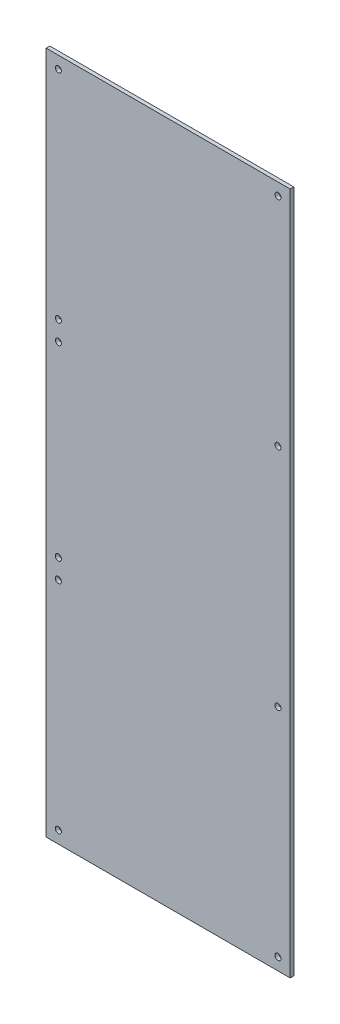
ISO-10303-21;
HEADER;
FILE_DESCRIPTION(('STEP AP214'),'2;1');
FILE_NAME('part.step','',(''),(''),'','','');
FILE_SCHEMA(('AUTOMOTIVE_DESIGN { 1 0 10303 214 1 1 1 1 }'));
ENDSEC;
DATA;
#1=APPLICATION_CONTEXT('core data for automotive mechanical design processes');
#2=APPLICATION_PROTOCOL_DEFINITION('international standard','automotive_design',2000,#1);
#3=PRODUCT_CONTEXT('',#1,'mechanical');
#4=PRODUCT('Part','Part','',(#3));
#5=PRODUCT_RELATED_PRODUCT_CATEGORY('part','',(#4));
#6=PRODUCT_DEFINITION_FORMATION('','',#4);
#7=PRODUCT_DEFINITION_CONTEXT('part definition',#1,'design');
#8=PRODUCT_DEFINITION('design','',#6,#7);
#9=PRODUCT_DEFINITION_SHAPE('','',#8);
#10=(LENGTH_UNIT() NAMED_UNIT(*) SI_UNIT(.MILLI.,.METRE.));
#11=(NAMED_UNIT(*) PLANE_ANGLE_UNIT() SI_UNIT($,.RADIAN.));
#12=(NAMED_UNIT(*) SI_UNIT($,.STERADIAN.) SOLID_ANGLE_UNIT());
#13=UNCERTAINTY_MEASURE_WITH_UNIT(LENGTH_MEASURE(1.E-05),#10,'distance_accuracy_value','');
#14=(GEOMETRIC_REPRESENTATION_CONTEXT(3) GLOBAL_UNCERTAINTY_ASSIGNED_CONTEXT((#13)) GLOBAL_UNIT_ASSIGNED_CONTEXT((#10,
#11,#12)) REPRESENTATION_CONTEXT('',''));
#15=CARTESIAN_POINT('',(0.,0.,0.));
#16=DIRECTION('',(0.,0.,1.));
#17=DIRECTION('',(1.,0.,0.));
#18=AXIS2_PLACEMENT_3D('',#15,#16,#17);
#19=CARTESIAN_POINT('',(-34.3589743589744,84.102564102564,3.));
#20=DIRECTION('',(1.,0.,0.));
#21=DIRECTION('',(0.,1.,0.));
#22=AXIS2_PLACEMENT_3D('',#19,#20,#21);
#23=PLANE('',#22);
#24=DIRECTION('',(0.,-1.,0.));
#25=VECTOR('',#24,1.);
#26=CARTESIAN_POINT('',(-34.3589743589744,84.102564102564,0.));
#27=LINE('',#26,#25);
#28=CARTESIAN_POINT('',(-34.3589743589744,84.102564102564,0.));
#29=VERTEX_POINT('',#28);
#30=CARTESIAN_POINT('',(-34.3589743589743,-475.897435897436,0.));
#31=VERTEX_POINT('',#30);
#32=EDGE_CURVE('E95',#29,#31,#27,.T.);
#33=ORIENTED_EDGE('',*,*,#32,.T.);
#34=DIRECTION('',(0.,0.,-1.));
#35=VECTOR('',#34,1.);
#36=CARTESIAN_POINT('',(-34.3589743589743,-475.897435897436,3.));
#37=LINE('',#36,#35);
#38=CARTESIAN_POINT('',(-34.3589743589743,-475.897435897436,3.));
#39=VERTEX_POINT('',#38);
#40=EDGE_CURVE('E11',#39,#31,#37,.T.);
#41=ORIENTED_EDGE('',*,*,#40,.F.);
#42=DIRECTION('',(0.,-1.,0.));
#43=VECTOR('',#42,1.);
#44=CARTESIAN_POINT('',(-34.3589743589744,84.102564102564,3.));
#45=LINE('',#44,#43);
#46=CARTESIAN_POINT('',(-34.3589743589744,84.102564102564,3.));
#47=VERTEX_POINT('',#46);
#48=EDGE_CURVE('E83',#47,#39,#45,.T.);
#49=ORIENTED_EDGE('',*,*,#48,.F.);
#50=DIRECTION('',(0.,0.,-1.));
#51=VECTOR('',#50,1.);
#52=CARTESIAN_POINT('',(-34.3589743589744,84.102564102564,3.));
#53=LINE('',#52,#51);
#54=EDGE_CURVE('E91',#47,#29,#53,.T.);
#55=ORIENTED_EDGE('',*,*,#54,.T.);
#56=EDGE_LOOP('',(#33,#41,#49,#55));
#57=FACE_BOUND('',#56,.T.);
#58=ADVANCED_FACE('F32',(#57),#23,.F.);
#59=CARTESIAN_POINT('',(-34.3589743589743,-475.897435897436,3.));
#60=DIRECTION('',(0.,1.,0.));
#61=DIRECTION('',(0.,0.,1.));
#62=AXIS2_PLACEMENT_3D('',#59,#60,#61);
#63=PLANE('',#62);
#64=DIRECTION('',(1.,0.,0.));
#65=VECTOR('',#64,1.);
#66=CARTESIAN_POINT('',(-34.3589743589743,-475.897435897436,0.));
#67=LINE('',#66,#65);
#68=CARTESIAN_POINT('',(165.641025641026,-475.897435897436,0.));
#69=VERTEX_POINT('',#68);
#70=EDGE_CURVE('E87',#31,#69,#67,.T.);
#71=ORIENTED_EDGE('',*,*,#70,.T.);
#72=DIRECTION('',(0.,0.,-1.));
#73=VECTOR('',#72,1.);
#74=CARTESIAN_POINT('',(165.641025641026,-475.897435897436,3.));
#75=LINE('',#74,#73);
#76=CARTESIAN_POINT('',(165.641025641026,-475.897435897436,3.));
#77=VERTEX_POINT('',#76);
#78=EDGE_CURVE('E40',#77,#69,#75,.T.);
#79=ORIENTED_EDGE('',*,*,#78,.F.);
#80=DIRECTION('',(1.,0.,0.));
#81=VECTOR('',#80,1.);
#82=CARTESIAN_POINT('',(-34.3589743589743,-475.897435897436,3.));
#83=LINE('',#82,#81);
#84=EDGE_CURVE('E78',#39,#77,#83,.T.);
#85=ORIENTED_EDGE('',*,*,#84,.F.);
#86=ORIENTED_EDGE('',*,*,#40,.T.);
#87=EDGE_LOOP('',(#71,#79,#85,#86));
#88=FACE_BOUND('',#87,.T.);
#89=ADVANCED_FACE('F86',(#88),#63,.F.);
#90=CARTESIAN_POINT('',(165.641025641026,84.102564102564,3.));
#91=DIRECTION('',(-1.,0.,0.));
#92=DIRECTION('',(0.,-1.,0.));
#93=AXIS2_PLACEMENT_3D('',#90,#91,#92);
#94=PLANE('',#93);
#95=DIRECTION('',(0.,1.,0.));
#96=VECTOR('',#95,1.);
#97=CARTESIAN_POINT('',(165.641025641026,84.102564102564,0.));
#98=LINE('',#97,#96);
#99=CARTESIAN_POINT('',(165.641025641026,84.102564102564,0.));
#100=VERTEX_POINT('',#99);
#101=EDGE_CURVE('E65',#69,#100,#98,.T.);
#102=ORIENTED_EDGE('',*,*,#101,.T.);
#103=DIRECTION('',(0.,0.,-1.));
#104=VECTOR('',#103,1.);
#105=CARTESIAN_POINT('',(165.641025641026,84.102564102564,3.));
#106=LINE('',#105,#104);
#107=CARTESIAN_POINT('',(165.641025641026,84.102564102564,3.));
#108=VERTEX_POINT('',#107);
#109=EDGE_CURVE('E88',#108,#100,#106,.T.);
#110=ORIENTED_EDGE('',*,*,#109,.F.);
#111=DIRECTION('',(0.,1.,0.));
#112=VECTOR('',#111,1.);
#113=CARTESIAN_POINT('',(165.641025641026,84.102564102564,3.));
#114=LINE('',#113,#112);
#115=EDGE_CURVE('E81',#77,#108,#114,.T.);
#116=ORIENTED_EDGE('',*,*,#115,.F.);
#117=ORIENTED_EDGE('',*,*,#78,.T.);
#118=EDGE_LOOP('',(#102,#110,#116,#117));
#119=FACE_BOUND('',#118,.T.);
#120=ADVANCED_FACE('F89',(#119),#94,.F.);
#121=CARTESIAN_POINT('',(-34.3589743589744,84.102564102564,3.));
#122=DIRECTION('',(0.,-1.,0.));
#123=DIRECTION('',(0.,0.,-1.));
#124=AXIS2_PLACEMENT_3D('',#121,#122,#123);
#125=PLANE('',#124);
#126=DIRECTION('',(-1.,0.,0.));
#127=VECTOR('',#126,1.);
#128=CARTESIAN_POINT('',(-34.3589743589744,84.102564102564,0.));
#129=LINE('',#128,#127);
#130=EDGE_CURVE('E71',#100,#29,#129,.T.);
#131=ORIENTED_EDGE('',*,*,#130,.T.);
#132=ORIENTED_EDGE('',*,*,#54,.F.);
#133=DIRECTION('',(-1.,0.,0.));
#134=VECTOR('',#133,1.);
#135=CARTESIAN_POINT('',(-34.3589743589744,84.102564102564,3.));
#136=LINE('',#135,#134);
#137=EDGE_CURVE('E48',#108,#47,#136,.T.);
#138=ORIENTED_EDGE('',*,*,#137,.F.);
#139=ORIENTED_EDGE('',*,*,#109,.T.);
#140=EDGE_LOOP('',(#131,#132,#138,#139));
#141=FACE_BOUND('',#140,.T.);
#142=ADVANCED_FACE('F103',(#141),#125,.F.);
#143=CARTESIAN_POINT('',(0.,0.,3.));
#144=DIRECTION('',(0.,0.,1.));
#145=DIRECTION('',(1.,0.,0.));
#146=AXIS2_PLACEMENT_3D('',#143,#144,#145);
#147=PLANE('',#146);
#148=CARTESIAN_POINT('',(155.641025641026,-288.397435897436,3.));
#149=DIRECTION('',(0.,0.,1.));
#150=DIRECTION('',(1.,0.,0.));
#151=AXIS2_PLACEMENT_3D('',#148,#149,#150);
#152=CIRCLE('',#151,2.5);
#153=CARTESIAN_POINT('',(158.141025641026,-288.397435897436,3.));
#154=VERTEX_POINT('',#153);
#155=EDGE_CURVE('E139',#154,#154,#152,.T.);
#156=ORIENTED_EDGE('',*,*,#155,.F.);
#157=EDGE_LOOP('',(#156));
#158=FACE_BOUND('',#157,.T.);
#159=CARTESIAN_POINT('',(-24.3589743589744,-119.397435897436,3.));
#160=DIRECTION('',(0.,0.,1.));
#161=DIRECTION('',(1.,0.,0.));
#162=AXIS2_PLACEMENT_3D('',#159,#160,#161);
#163=CIRCLE('',#162,2.5);
#164=CARTESIAN_POINT('',(-21.8589743589744,-119.397435897436,3.));
#165=VERTEX_POINT('',#164);
#166=EDGE_CURVE('E146',#165,#165,#163,.T.);
#167=ORIENTED_EDGE('',*,*,#166,.F.);
#168=EDGE_LOOP('',(#167));
#169=FACE_BOUND('',#168,.T.);
#170=CARTESIAN_POINT('',(155.641025641026,-103.397435897436,3.));
#171=DIRECTION('',(0.,0.,1.));
#172=DIRECTION('',(1.,0.,0.));
#173=AXIS2_PLACEMENT_3D('',#170,#171,#172);
#174=CIRCLE('',#173,2.5);
#175=CARTESIAN_POINT('',(158.141025641026,-103.397435897436,3.));
#176=VERTEX_POINT('',#175);
#177=EDGE_CURVE('E152',#176,#176,#174,.T.);
#178=ORIENTED_EDGE('',*,*,#177,.F.);
#179=EDGE_LOOP('',(#178));
#180=FACE_BOUND('',#179,.T.);
#181=CARTESIAN_POINT('',(-24.3589743589744,-103.397435897436,3.));
#182=DIRECTION('',(0.,0.,1.));
#183=DIRECTION('',(1.,0.,0.));
#184=AXIS2_PLACEMENT_3D('',#181,#182,#183);
#185=CIRCLE('',#184,2.5);
#186=CARTESIAN_POINT('',(-21.8589743589744,-103.397435897436,3.));
#187=VERTEX_POINT('',#186);
#188=EDGE_CURVE('E158',#187,#187,#185,.T.);
#189=ORIENTED_EDGE('',*,*,#188,.F.);
#190=EDGE_LOOP('',(#189));
#191=FACE_BOUND('',#190,.T.);
#192=CARTESIAN_POINT('',(155.641025641026,74.102564102564,3.));
#193=DIRECTION('',(0.,0.,1.));
#194=DIRECTION('',(1.,0.,0.));
#195=AXIS2_PLACEMENT_3D('',#192,#193,#194);
#196=CIRCLE('',#195,2.5);
#197=CARTESIAN_POINT('',(158.141025641026,74.102564102564,3.));
#198=VERTEX_POINT('',#197);
#199=EDGE_CURVE('E122',#198,#198,#196,.T.);
#200=ORIENTED_EDGE('',*,*,#199,.F.);
#201=EDGE_LOOP('',(#200));
#202=FACE_BOUND('',#201,.T.);
#203=CARTESIAN_POINT('',(-24.3589743589744,-465.897435897436,3.));
#204=DIRECTION('',(0.,0.,1.));
#205=DIRECTION('',(1.,0.,0.));
#206=AXIS2_PLACEMENT_3D('',#203,#204,#205);
#207=CIRCLE('',#206,2.5);
#208=CARTESIAN_POINT('',(-21.8589743589744,-465.897435897436,3.));
#209=VERTEX_POINT('',#208);
#210=EDGE_CURVE('E115',#209,#209,#207,.T.);
#211=ORIENTED_EDGE('',*,*,#210,.F.);
#212=EDGE_LOOP('',(#211));
#213=FACE_BOUND('',#212,.T.);
#214=CARTESIAN_POINT('',(155.641025641026,-465.897435897436,3.));
#215=DIRECTION('',(0.,0.,1.));
#216=DIRECTION('',(1.,0.,0.));
#217=AXIS2_PLACEMENT_3D('',#214,#215,#216);
#218=CIRCLE('',#217,2.5);
#219=CARTESIAN_POINT('',(158.141025641026,-465.897435897436,3.));
#220=VERTEX_POINT('',#219);
#221=EDGE_CURVE('E134',#220,#220,#218,.T.);
#222=ORIENTED_EDGE('',*,*,#221,.F.);
#223=EDGE_LOOP('',(#222));
#224=FACE_BOUND('',#223,.T.);
#225=CARTESIAN_POINT('',(-24.3589743589744,-288.397435897436,3.));
#226=DIRECTION('',(0.,0.,1.));
#227=DIRECTION('',(1.,0.,0.));
#228=AXIS2_PLACEMENT_3D('',#225,#226,#227);
#229=CIRCLE('',#228,2.5);
#230=CARTESIAN_POINT('',(-21.8589743589744,-288.397435897436,3.));
#231=VERTEX_POINT('',#230);
#232=EDGE_CURVE('E127',#231,#231,#229,.T.);
#233=ORIENTED_EDGE('',*,*,#232,.F.);
#234=EDGE_LOOP('',(#233));
#235=FACE_BOUND('',#234,.T.);
#236=CARTESIAN_POINT('',(-24.3589743589744,-272.397435897436,3.));
#237=DIRECTION('',(0.,0.,1.));
#238=DIRECTION('',(1.,0.,0.));
#239=AXIS2_PLACEMENT_3D('',#236,#237,#238);
#240=CIRCLE('',#239,2.5);
#241=CARTESIAN_POINT('',(-21.8589743589744,-272.397435897436,3.));
#242=VERTEX_POINT('',#241);
#243=EDGE_CURVE('E163',#242,#242,#240,.T.);
#244=ORIENTED_EDGE('',*,*,#243,.F.);
#245=EDGE_LOOP('',(#244));
#246=FACE_BOUND('',#245,.T.);
#247=CARTESIAN_POINT('',(-24.3589743589744,74.102564102564,3.));
#248=DIRECTION('',(0.,0.,1.));
#249=DIRECTION('',(1.,0.,0.));
#250=AXIS2_PLACEMENT_3D('',#247,#248,#249);
#251=CIRCLE('',#250,2.5);
#252=CARTESIAN_POINT('',(-21.8589743589744,74.102564102564,3.));
#253=VERTEX_POINT('',#252);
#254=EDGE_CURVE('E109',#253,#253,#251,.T.);
#255=ORIENTED_EDGE('',*,*,#254,.F.);
#256=EDGE_LOOP('',(#255));
#257=FACE_BOUND('',#256,.T.);
#258=ORIENTED_EDGE('',*,*,#48,.T.);
#259=ORIENTED_EDGE('',*,*,#84,.T.);
#260=ORIENTED_EDGE('',*,*,#115,.T.);
#261=ORIENTED_EDGE('',*,*,#137,.T.);
#262=EDGE_LOOP('',(#258,#259,#260,#261));
#263=FACE_BOUND('',#262,.T.);
#264=ADVANCED_FACE('F79',(#158,#169,#180,#191,#202,#213,#224,#235,#246,#257,#263),#147,.T.);
#265=CARTESIAN_POINT('',(0.,0.,0.));
#266=DIRECTION('',(0.,0.,1.));
#267=DIRECTION('',(1.,0.,0.));
#268=AXIS2_PLACEMENT_3D('',#265,#266,#267);
#269=PLANE('',#268);
#270=CARTESIAN_POINT('',(155.641025641026,-288.397435897436,0.));
#271=DIRECTION('',(0.,0.,1.));
#272=DIRECTION('',(1.,0.,0.));
#273=AXIS2_PLACEMENT_3D('',#270,#271,#272);
#274=CIRCLE('',#273,2.5);
#275=CARTESIAN_POINT('',(158.141025641026,-288.397435897436,0.));
#276=VERTEX_POINT('',#275);
#277=EDGE_CURVE('E142',#276,#276,#274,.T.);
#278=ORIENTED_EDGE('',*,*,#277,.T.);
#279=EDGE_LOOP('',(#278));
#280=FACE_BOUND('',#279,.T.);
#281=CARTESIAN_POINT('',(-24.3589743589744,-119.397435897436,0.));
#282=DIRECTION('',(0.,0.,1.));
#283=DIRECTION('',(1.,0.,0.));
#284=AXIS2_PLACEMENT_3D('',#281,#282,#283);
#285=CIRCLE('',#284,2.5);
#286=CARTESIAN_POINT('',(-21.8589743589744,-119.397435897436,0.));
#287=VERTEX_POINT('',#286);
#288=EDGE_CURVE('E149',#287,#287,#285,.T.);
#289=ORIENTED_EDGE('',*,*,#288,.T.);
#290=EDGE_LOOP('',(#289));
#291=FACE_BOUND('',#290,.T.);
#292=CARTESIAN_POINT('',(155.641025641026,-103.397435897436,0.));
#293=DIRECTION('',(0.,0.,1.));
#294=DIRECTION('',(1.,0.,0.));
#295=AXIS2_PLACEMENT_3D('',#292,#293,#294);
#296=CIRCLE('',#295,2.5);
#297=CARTESIAN_POINT('',(158.141025641026,-103.397435897436,0.));
#298=VERTEX_POINT('',#297);
#299=EDGE_CURVE('E155',#298,#298,#296,.T.);
#300=ORIENTED_EDGE('',*,*,#299,.T.);
#301=EDGE_LOOP('',(#300));
#302=FACE_BOUND('',#301,.T.);
#303=CARTESIAN_POINT('',(-24.3589743589744,-103.397435897436,0.));
#304=DIRECTION('',(0.,0.,1.));
#305=DIRECTION('',(1.,0.,0.));
#306=AXIS2_PLACEMENT_3D('',#303,#304,#305);
#307=CIRCLE('',#306,2.5);
#308=CARTESIAN_POINT('',(-21.8589743589744,-103.397435897436,0.));
#309=VERTEX_POINT('',#308);
#310=EDGE_CURVE('E131',#309,#309,#307,.T.);
#311=ORIENTED_EDGE('',*,*,#310,.T.);
#312=EDGE_LOOP('',(#311));
#313=FACE_BOUND('',#312,.T.);
#314=CARTESIAN_POINT('',(155.641025641026,74.102564102564,0.));
#315=DIRECTION('',(0.,0.,1.));
#316=DIRECTION('',(1.,0.,0.));
#317=AXIS2_PLACEMENT_3D('',#314,#315,#316);
#318=CIRCLE('',#317,2.5);
#319=CARTESIAN_POINT('',(158.141025641026,74.102564102564,0.));
#320=VERTEX_POINT('',#319);
#321=EDGE_CURVE('E112',#320,#320,#318,.T.);
#322=ORIENTED_EDGE('',*,*,#321,.T.);
#323=EDGE_LOOP('',(#322));
#324=FACE_BOUND('',#323,.T.);
#325=CARTESIAN_POINT('',(-24.3589743589744,-465.897435897436,0.));
#326=DIRECTION('',(0.,0.,1.));
#327=DIRECTION('',(1.,0.,0.));
#328=AXIS2_PLACEMENT_3D('',#325,#326,#327);
#329=CIRCLE('',#328,2.5);
#330=CARTESIAN_POINT('',(-21.8589743589744,-465.897435897436,0.));
#331=VERTEX_POINT('',#330);
#332=EDGE_CURVE('E118',#331,#331,#329,.T.);
#333=ORIENTED_EDGE('',*,*,#332,.T.);
#334=EDGE_LOOP('',(#333));
#335=FACE_BOUND('',#334,.T.);
#336=CARTESIAN_POINT('',(155.641025641026,-465.897435897436,0.));
#337=DIRECTION('',(0.,0.,1.));
#338=DIRECTION('',(1.,0.,0.));
#339=AXIS2_PLACEMENT_3D('',#336,#337,#338);
#340=CIRCLE('',#339,2.5);
#341=CARTESIAN_POINT('',(158.141025641026,-465.897435897436,0.));
#342=VERTEX_POINT('',#341);
#343=EDGE_CURVE('E119',#342,#342,#340,.T.);
#344=ORIENTED_EDGE('',*,*,#343,.T.);
#345=EDGE_LOOP('',(#344));
#346=FACE_BOUND('',#345,.T.);
#347=CARTESIAN_POINT('',(-24.3589743589744,-288.397435897436,0.));
#348=DIRECTION('',(0.,0.,1.));
#349=DIRECTION('',(1.,0.,0.));
#350=AXIS2_PLACEMENT_3D('',#347,#348,#349);
#351=CIRCLE('',#350,2.5);
#352=CARTESIAN_POINT('',(-21.8589743589744,-288.397435897436,0.));
#353=VERTEX_POINT('',#352);
#354=EDGE_CURVE('E130',#353,#353,#351,.T.);
#355=ORIENTED_EDGE('',*,*,#354,.T.);
#356=EDGE_LOOP('',(#355));
#357=FACE_BOUND('',#356,.T.);
#358=CARTESIAN_POINT('',(-24.3589743589744,-272.397435897436,0.));
#359=DIRECTION('',(0.,0.,1.));
#360=DIRECTION('',(1.,0.,0.));
#361=AXIS2_PLACEMENT_3D('',#358,#359,#360);
#362=CIRCLE('',#361,2.5);
#363=CARTESIAN_POINT('',(-21.8589743589744,-272.397435897436,0.));
#364=VERTEX_POINT('',#363);
#365=EDGE_CURVE('E143',#364,#364,#362,.T.);
#366=ORIENTED_EDGE('',*,*,#365,.T.);
#367=EDGE_LOOP('',(#366));
#368=FACE_BOUND('',#367,.T.);
#369=CARTESIAN_POINT('',(-24.3589743589744,74.102564102564,0.));
#370=DIRECTION('',(0.,0.,1.));
#371=DIRECTION('',(1.,0.,0.));
#372=AXIS2_PLACEMENT_3D('',#369,#370,#371);
#373=CIRCLE('',#372,2.5);
#374=CARTESIAN_POINT('',(-21.8589743589744,74.102564102564,0.));
#375=VERTEX_POINT('',#374);
#376=EDGE_CURVE('E98',#375,#375,#373,.T.);
#377=ORIENTED_EDGE('',*,*,#376,.T.);
#378=EDGE_LOOP('',(#377));
#379=FACE_BOUND('',#378,.T.);
#380=ORIENTED_EDGE('',*,*,#32,.F.);
#381=ORIENTED_EDGE('',*,*,#130,.F.);
#382=ORIENTED_EDGE('',*,*,#101,.F.);
#383=ORIENTED_EDGE('',*,*,#70,.F.);
#384=EDGE_LOOP('',(#380,#381,#382,#383));
#385=FACE_BOUND('',#384,.T.);
#386=ADVANCED_FACE('F106',(#280,#291,#302,#313,#324,#335,#346,#357,#368,#379,#385),#269,.F.);
#387=CARTESIAN_POINT('',(-24.3589743589744,74.102564102564,0.));
#388=DIRECTION('',(0.,0.,1.));
#389=DIRECTION('',(1.,0.,0.));
#390=AXIS2_PLACEMENT_3D('',#387,#388,#389);
#391=CYLINDRICAL_SURFACE('',#390,2.5);
#392=ORIENTED_EDGE('',*,*,#376,.F.);
#393=EDGE_LOOP('',(#392));
#394=FACE_BOUND('',#393,.T.);
#395=ORIENTED_EDGE('',*,*,#254,.T.);
#396=EDGE_LOOP('',(#395));
#397=FACE_BOUND('',#396,.T.);
#398=ADVANCED_FACE('F175',(#394,#397),#391,.F.);
#399=CARTESIAN_POINT('',(-24.3589743589744,-272.397435897436,0.));
#400=DIRECTION('',(0.,0.,1.));
#401=DIRECTION('',(1.,0.,0.));
#402=AXIS2_PLACEMENT_3D('',#399,#400,#401);
#403=CYLINDRICAL_SURFACE('',#402,2.5);
#404=ORIENTED_EDGE('',*,*,#365,.F.);
#405=EDGE_LOOP('',(#404));
#406=FACE_BOUND('',#405,.T.);
#407=ORIENTED_EDGE('',*,*,#243,.T.);
#408=EDGE_LOOP('',(#407));
#409=FACE_BOUND('',#408,.T.);
#410=ADVANCED_FACE('F171',(#406,#409),#403,.F.);
#411=CARTESIAN_POINT('',(-24.3589743589744,-288.397435897436,0.));
#412=DIRECTION('',(0.,0.,1.));
#413=DIRECTION('',(1.,0.,0.));
#414=AXIS2_PLACEMENT_3D('',#411,#412,#413);
#415=CYLINDRICAL_SURFACE('',#414,2.5);
#416=ORIENTED_EDGE('',*,*,#354,.F.);
#417=EDGE_LOOP('',(#416));
#418=FACE_BOUND('',#417,.T.);
#419=ORIENTED_EDGE('',*,*,#232,.T.);
#420=EDGE_LOOP('',(#419));
#421=FACE_BOUND('',#420,.T.);
#422=ADVANCED_FACE('F174',(#418,#421),#415,.F.);
#423=CARTESIAN_POINT('',(155.641025641026,-465.897435897436,0.));
#424=DIRECTION('',(0.,0.,1.));
#425=DIRECTION('',(1.,0.,0.));
#426=AXIS2_PLACEMENT_3D('',#423,#424,#425);
#427=CYLINDRICAL_SURFACE('',#426,2.5);
#428=ORIENTED_EDGE('',*,*,#343,.F.);
#429=EDGE_LOOP('',(#428));
#430=FACE_BOUND('',#429,.T.);
#431=ORIENTED_EDGE('',*,*,#221,.T.);
#432=EDGE_LOOP('',(#431));
#433=FACE_BOUND('',#432,.T.);
#434=ADVANCED_FACE('F238',(#430,#433),#427,.F.);
#435=CARTESIAN_POINT('',(-24.3589743589744,-465.897435897436,0.));
#436=DIRECTION('',(0.,0.,1.));
#437=DIRECTION('',(1.,0.,0.));
#438=AXIS2_PLACEMENT_3D('',#435,#436,#437);
#439=CYLINDRICAL_SURFACE('',#438,2.5);
#440=ORIENTED_EDGE('',*,*,#332,.F.);
#441=EDGE_LOOP('',(#440));
#442=FACE_BOUND('',#441,.T.);
#443=ORIENTED_EDGE('',*,*,#210,.T.);
#444=EDGE_LOOP('',(#443));
#445=FACE_BOUND('',#444,.T.);
#446=ADVANCED_FACE('F248',(#442,#445),#439,.F.);
#447=CARTESIAN_POINT('',(155.641025641026,74.102564102564,0.));
#448=DIRECTION('',(0.,0.,1.));
#449=DIRECTION('',(1.,0.,0.));
#450=AXIS2_PLACEMENT_3D('',#447,#448,#449);
#451=CYLINDRICAL_SURFACE('',#450,2.5);
#452=ORIENTED_EDGE('',*,*,#321,.F.);
#453=EDGE_LOOP('',(#452));
#454=FACE_BOUND('',#453,.T.);
#455=ORIENTED_EDGE('',*,*,#199,.T.);
#456=EDGE_LOOP('',(#455));
#457=FACE_BOUND('',#456,.T.);
#458=ADVANCED_FACE('F258',(#454,#457),#451,.F.);
#459=CARTESIAN_POINT('',(-24.3589743589744,-103.397435897436,0.));
#460=DIRECTION('',(0.,0.,1.));
#461=DIRECTION('',(1.,0.,0.));
#462=AXIS2_PLACEMENT_3D('',#459,#460,#461);
#463=CYLINDRICAL_SURFACE('',#462,2.5);
#464=ORIENTED_EDGE('',*,*,#310,.F.);
#465=EDGE_LOOP('',(#464));
#466=FACE_BOUND('',#465,.T.);
#467=ORIENTED_EDGE('',*,*,#188,.T.);
#468=EDGE_LOOP('',(#467));
#469=FACE_BOUND('',#468,.T.);
#470=ADVANCED_FACE('F267',(#466,#469),#463,.F.);
#471=CARTESIAN_POINT('',(155.641025641026,-103.397435897436,0.));
#472=DIRECTION('',(0.,0.,1.));
#473=DIRECTION('',(1.,0.,0.));
#474=AXIS2_PLACEMENT_3D('',#471,#472,#473);
#475=CYLINDRICAL_SURFACE('',#474,2.5);
#476=ORIENTED_EDGE('',*,*,#299,.F.);
#477=EDGE_LOOP('',(#476));
#478=FACE_BOUND('',#477,.T.);
#479=ORIENTED_EDGE('',*,*,#177,.T.);
#480=EDGE_LOOP('',(#479));
#481=FACE_BOUND('',#480,.T.);
#482=ADVANCED_FACE('F277',(#478,#481),#475,.F.);
#483=CARTESIAN_POINT('',(-24.3589743589744,-119.397435897436,0.));
#484=DIRECTION('',(0.,0.,1.));
#485=DIRECTION('',(1.,0.,0.));
#486=AXIS2_PLACEMENT_3D('',#483,#484,#485);
#487=CYLINDRICAL_SURFACE('',#486,2.5);
#488=ORIENTED_EDGE('',*,*,#288,.F.);
#489=EDGE_LOOP('',(#488));
#490=FACE_BOUND('',#489,.T.);
#491=ORIENTED_EDGE('',*,*,#166,.T.);
#492=EDGE_LOOP('',(#491));
#493=FACE_BOUND('',#492,.T.);
#494=ADVANCED_FACE('F287',(#490,#493),#487,.F.);
#495=CARTESIAN_POINT('',(155.641025641026,-288.397435897436,0.));
#496=DIRECTION('',(0.,0.,1.));
#497=DIRECTION('',(1.,0.,0.));
#498=AXIS2_PLACEMENT_3D('',#495,#496,#497);
#499=CYLINDRICAL_SURFACE('',#498,2.5);
#500=ORIENTED_EDGE('',*,*,#277,.F.);
#501=EDGE_LOOP('',(#500));
#502=FACE_BOUND('',#501,.T.);
#503=ORIENTED_EDGE('',*,*,#155,.T.);
#504=EDGE_LOOP('',(#503));
#505=FACE_BOUND('',#504,.T.);
#506=ADVANCED_FACE('F297',(#502,#505),#499,.F.);
#507=CLOSED_SHELL('',(#58,#89,#120,#142,#264,#386,#398,#410,#422,#434,#446,#458,#470,#482,#494,#506));
#508=MANIFOLD_SOLID_BREP('B2',#507);
#509=ADVANCED_BREP_SHAPE_REPRESENTATION('',(#18,#508),#14);
#510=SHAPE_DEFINITION_REPRESENTATION(#9,#509);
ENDSEC;
END-ISO-10303-21;
